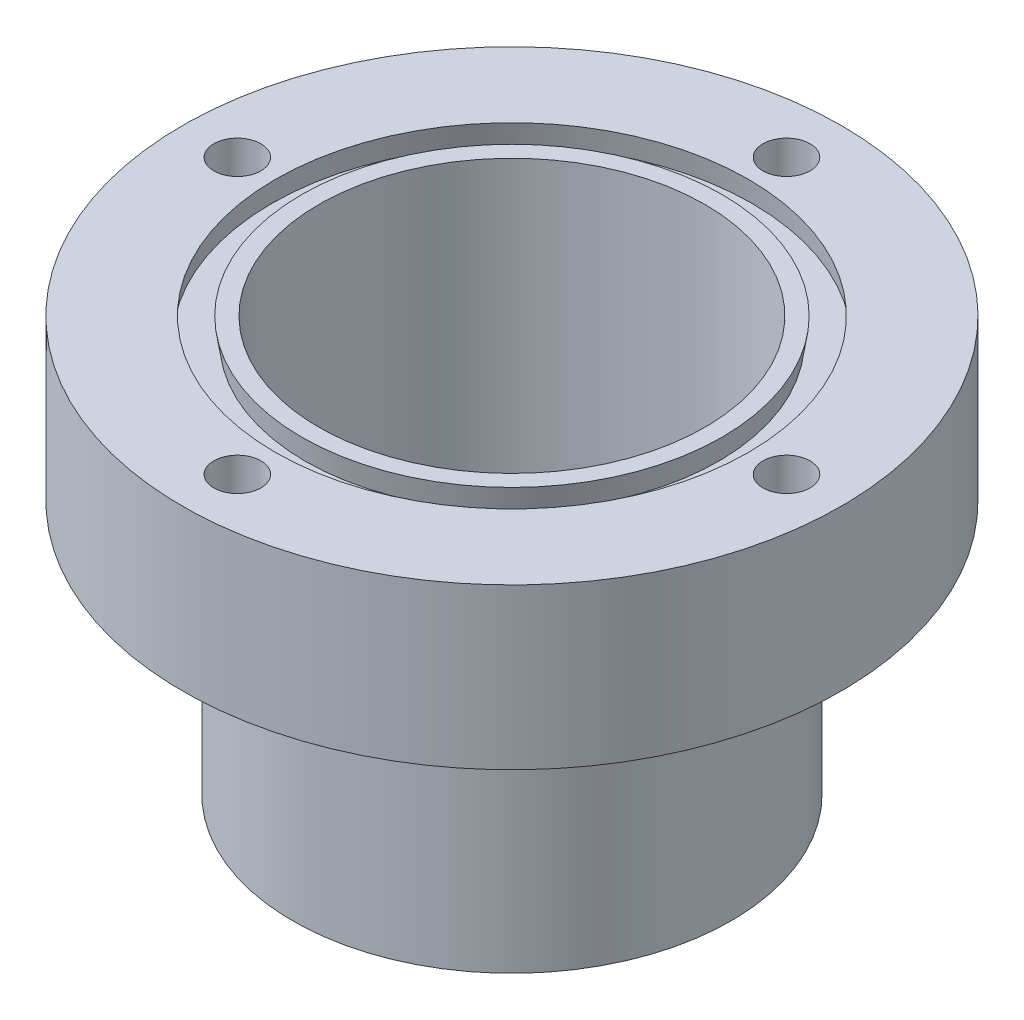
ISO-10303-21;
HEADER;
FILE_DESCRIPTION(('STEP AP214'),'2;1');
FILE_NAME('part.step','',(''),(''),'','','');
FILE_SCHEMA(('AUTOMOTIVE_DESIGN { 1 0 10303 214 1 1 1 1 }'));
ENDSEC;
DATA;
#1=APPLICATION_CONTEXT('core data for automotive mechanical design processes');
#2=APPLICATION_PROTOCOL_DEFINITION('international standard','automotive_design',2000,#1);
#3=PRODUCT_CONTEXT('',#1,'mechanical');
#4=PRODUCT('Part','Part','',(#3));
#5=PRODUCT_RELATED_PRODUCT_CATEGORY('part','',(#4));
#6=PRODUCT_DEFINITION_FORMATION('','',#4);
#7=PRODUCT_DEFINITION_CONTEXT('part definition',#1,'design');
#8=PRODUCT_DEFINITION('design','',#6,#7);
#9=PRODUCT_DEFINITION_SHAPE('','',#8);
#10=(LENGTH_UNIT() NAMED_UNIT(*) SI_UNIT(.MILLI.,.METRE.));
#11=(NAMED_UNIT(*) PLANE_ANGLE_UNIT() SI_UNIT($,.RADIAN.));
#12=(NAMED_UNIT(*) SI_UNIT($,.STERADIAN.) SOLID_ANGLE_UNIT());
#13=UNCERTAINTY_MEASURE_WITH_UNIT(LENGTH_MEASURE(1.E-05),#10,'distance_accuracy_value','');
#14=(GEOMETRIC_REPRESENTATION_CONTEXT(3) GLOBAL_UNCERTAINTY_ASSIGNED_CONTEXT((#13)) GLOBAL_UNIT_ASSIGNED_CONTEXT((#10,
#11,#12)) REPRESENTATION_CONTEXT('',''));
#15=CARTESIAN_POINT('',(0.,0.,0.));
#16=DIRECTION('',(0.,0.,1.));
#17=DIRECTION('',(1.,0.,0.));
#18=AXIS2_PLACEMENT_3D('',#15,#16,#17);
#19=CARTESIAN_POINT('',(0.,13.5,0.));
#20=DIRECTION('',(0.,-1.,0.));
#21=DIRECTION('',(0.,0.,-1.));
#22=AXIS2_PLACEMENT_3D('',#19,#20,#21);
#23=PLANE('',#22);
#24=CARTESIAN_POINT('',(0.,13.5,-14.58));
#25=DIRECTION('',(0.,1.,0.));
#26=DIRECTION('',(0.,0.,1.));
#27=AXIS2_PLACEMENT_3D('',#24,#25,#26);
#28=CIRCLE('',#27,1.25);
#29=CARTESIAN_POINT('',(0.,13.5,-13.33));
#30=VERTEX_POINT('',#29);
#31=EDGE_CURVE('P0_E73',#30,#30,#28,.T.);
#32=ORIENTED_EDGE('',*,*,#31,.T.);
#33=EDGE_LOOP('',(#32));
#34=FACE_BOUND('',#33,.T.);
#35=CARTESIAN_POINT('',(-14.58,13.5,0.));
#36=DIRECTION('',(0.,1.,0.));
#37=DIRECTION('',(0.,0.,1.));
#38=AXIS2_PLACEMENT_3D('',#35,#36,#37);
#39=CIRCLE('',#38,1.25);
#40=CARTESIAN_POINT('',(-14.58,13.5,1.25));
#41=VERTEX_POINT('',#40);
#42=EDGE_CURVE('P0_E76',#41,#41,#39,.T.);
#43=ORIENTED_EDGE('',*,*,#42,.T.);
#44=EDGE_LOOP('',(#43));
#45=FACE_BOUND('',#44,.T.);
#46=CARTESIAN_POINT('',(0.,13.5,14.58));
#47=DIRECTION('',(0.,1.,0.));
#48=DIRECTION('',(0.,0.,1.));
#49=AXIS2_PLACEMENT_3D('',#46,#47,#48);
#50=CIRCLE('',#49,1.25);
#51=CARTESIAN_POINT('',(0.,13.5,15.83));
#52=VERTEX_POINT('',#51);
#53=EDGE_CURVE('P0_E79',#52,#52,#50,.T.);
#54=ORIENTED_EDGE('',*,*,#53,.T.);
#55=EDGE_LOOP('',(#54));
#56=FACE_BOUND('',#55,.T.);
#57=CARTESIAN_POINT('',(14.58,13.5,0.));
#58=DIRECTION('',(0.,1.,0.));
#59=DIRECTION('',(0.,0.,1.));
#60=AXIS2_PLACEMENT_3D('',#57,#58,#59);
#61=CIRCLE('',#60,1.25);
#62=CARTESIAN_POINT('',(14.58,13.5,1.25));
#63=VERTEX_POINT('',#62);
#64=EDGE_CURVE('P0_E81',#63,#63,#61,.T.);
#65=ORIENTED_EDGE('',*,*,#64,.T.);
#66=EDGE_LOOP('',(#65));
#67=FACE_BOUND('',#66,.T.);
#68=CARTESIAN_POINT('',(0.,13.5,0.));
#69=DIRECTION('',(0.,-1.,0.));
#70=DIRECTION('',(0.,0.,-1.));
#71=AXIS2_PLACEMENT_3D('',#68,#69,#70);
#72=CIRCLE('',#71,11.645);
#73=CARTESIAN_POINT('',(0.,13.5,-11.645));
#74=VERTEX_POINT('',#73);
#75=EDGE_CURVE('P0_E70',#74,#74,#72,.T.);
#76=ORIENTED_EDGE('',*,*,#75,.F.);
#77=EDGE_LOOP('',(#76));
#78=FACE_BOUND('',#77,.T.);
#79=CARTESIAN_POINT('',(0.,13.5,0.));
#80=DIRECTION('',(0.,-1.,0.));
#81=DIRECTION('',(0.,0.,-1.));
#82=AXIS2_PLACEMENT_3D('',#79,#80,#81);
#83=CIRCLE('',#82,17.5);
#84=CARTESIAN_POINT('',(0.,13.5,-17.5));
#85=VERTEX_POINT('',#84);
#86=EDGE_CURVE('P0_E17',#85,#85,#83,.F.);
#87=ORIENTED_EDGE('',*,*,#86,.F.);
#88=EDGE_LOOP('',(#87));
#89=FACE_BOUND('',#88,.T.);
#90=ADVANCED_FACE('P0_F14',(#34,#45,#56,#67,#78,#89),#23,.T.);
#91=CARTESIAN_POINT('',(0.,23.15,0.));
#92=DIRECTION('',(0.,-1.,0.));
#93=DIRECTION('',(0.,0.,-1.));
#94=AXIS2_PLACEMENT_3D('',#91,#92,#93);
#95=CYLINDRICAL_SURFACE('',#94,17.5);
#96=ORIENTED_EDGE('',*,*,#86,.T.);
#97=EDGE_LOOP('',(#96));
#98=FACE_BOUND('',#97,.T.);
#99=CARTESIAN_POINT('',(0.,22.,0.));
#100=DIRECTION('',(0.,-1.,0.));
#101=DIRECTION('',(0.,0.,-1.));
#102=AXIS2_PLACEMENT_3D('',#99,#100,#101);
#103=CIRCLE('',#102,17.5);
#104=CARTESIAN_POINT('',(0.,22.,-17.5));
#105=VERTEX_POINT('',#104);
#106=EDGE_CURVE('P0_E67',#105,#105,#103,.T.);
#107=ORIENTED_EDGE('',*,*,#106,.T.);
#108=EDGE_LOOP('',(#107));
#109=FACE_BOUND('',#108,.T.);
#110=ADVANCED_FACE('P0_F88',(#98,#109),#95,.T.);
#111=CARTESIAN_POINT('',(14.58,10.71137043753,0.));
#112=DIRECTION('',(0.,1.,0.));
#113=DIRECTION('',(0.,0.,1.));
#114=AXIS2_PLACEMENT_3D('',#111,#112,#113);
#115=CYLINDRICAL_SURFACE('',#114,1.25);
#116=ORIENTED_EDGE('',*,*,#64,.F.);
#117=EDGE_LOOP('',(#116));
#118=FACE_BOUND('',#117,.T.);
#119=CARTESIAN_POINT('',(14.58,22.,0.));
#120=DIRECTION('',(0.,1.,0.));
#121=DIRECTION('',(0.,0.,1.));
#122=AXIS2_PLACEMENT_3D('',#119,#120,#121);
#123=CIRCLE('',#122,1.25);
#124=CARTESIAN_POINT('',(14.58,22.,1.25));
#125=VERTEX_POINT('',#124);
#126=EDGE_CURVE('P0_E64',#125,#125,#123,.T.);
#127=ORIENTED_EDGE('',*,*,#126,.T.);
#128=EDGE_LOOP('',(#127));
#129=FACE_BOUND('',#128,.T.);
#130=ADVANCED_FACE('P0_F97',(#118,#129),#115,.F.);
#131=CARTESIAN_POINT('',(0.,10.71137043753,14.58));
#132=DIRECTION('',(0.,1.,0.));
#133=DIRECTION('',(0.,0.,1.));
#134=AXIS2_PLACEMENT_3D('',#131,#132,#133);
#135=CYLINDRICAL_SURFACE('',#134,1.25);
#136=ORIENTED_EDGE('',*,*,#53,.F.);
#137=EDGE_LOOP('',(#136));
#138=FACE_BOUND('',#137,.T.);
#139=CARTESIAN_POINT('',(0.,22.,14.58));
#140=DIRECTION('',(0.,1.,0.));
#141=DIRECTION('',(0.,0.,1.));
#142=AXIS2_PLACEMENT_3D('',#139,#140,#141);
#143=CIRCLE('',#142,1.25);
#144=CARTESIAN_POINT('',(0.,22.,15.83));
#145=VERTEX_POINT('',#144);
#146=EDGE_CURVE('P0_E61',#145,#145,#143,.T.);
#147=ORIENTED_EDGE('',*,*,#146,.T.);
#148=EDGE_LOOP('',(#147));
#149=FACE_BOUND('',#148,.T.);
#150=ADVANCED_FACE('P0_F159',(#138,#149),#135,.F.);
#151=CARTESIAN_POINT('',(-14.58,10.71137043753,0.));
#152=DIRECTION('',(0.,1.,0.));
#153=DIRECTION('',(0.,0.,1.));
#154=AXIS2_PLACEMENT_3D('',#151,#152,#153);
#155=CYLINDRICAL_SURFACE('',#154,1.25);
#156=ORIENTED_EDGE('',*,*,#42,.F.);
#157=EDGE_LOOP('',(#156));
#158=FACE_BOUND('',#157,.T.);
#159=CARTESIAN_POINT('',(-14.58,22.,0.));
#160=DIRECTION('',(0.,1.,0.));
#161=DIRECTION('',(0.,0.,1.));
#162=AXIS2_PLACEMENT_3D('',#159,#160,#161);
#163=CIRCLE('',#162,1.25);
#164=CARTESIAN_POINT('',(-14.58,22.,1.25));
#165=VERTEX_POINT('',#164);
#166=EDGE_CURVE('P0_E58',#165,#165,#163,.T.);
#167=ORIENTED_EDGE('',*,*,#166,.T.);
#168=EDGE_LOOP('',(#167));
#169=FACE_BOUND('',#168,.T.);
#170=ADVANCED_FACE('P0_F155',(#158,#169),#155,.F.);
#171=CARTESIAN_POINT('',(0.,10.71137043753,-14.58));
#172=DIRECTION('',(0.,1.,0.));
#173=DIRECTION('',(0.,0.,1.));
#174=AXIS2_PLACEMENT_3D('',#171,#172,#173);
#175=CYLINDRICAL_SURFACE('',#174,1.25);
#176=ORIENTED_EDGE('',*,*,#31,.F.);
#177=EDGE_LOOP('',(#176));
#178=FACE_BOUND('',#177,.T.);
#179=CARTESIAN_POINT('',(0.,22.,-14.58));
#180=DIRECTION('',(0.,1.,0.));
#181=DIRECTION('',(0.,0.,1.));
#182=AXIS2_PLACEMENT_3D('',#179,#180,#181);
#183=CIRCLE('',#182,1.25);
#184=CARTESIAN_POINT('',(0.,22.,-13.33));
#185=VERTEX_POINT('',#184);
#186=EDGE_CURVE('P0_E55',#185,#185,#183,.T.);
#187=ORIENTED_EDGE('',*,*,#186,.T.);
#188=EDGE_LOOP('',(#187));
#189=FACE_BOUND('',#188,.T.);
#190=ADVANCED_FACE('P0_F151',(#178,#189),#175,.F.);
#191=CARTESIAN_POINT('',(0.,23.15,0.));
#192=DIRECTION('',(0.,-1.,0.));
#193=DIRECTION('',(0.,0.,-1.));
#194=AXIS2_PLACEMENT_3D('',#191,#192,#193);
#195=CYLINDRICAL_SURFACE('',#194,11.645);
#196=CARTESIAN_POINT('',(0.,0.,0.));
#197=DIRECTION('',(0.,-1.,0.));
#198=DIRECTION('',(0.,0.,-1.));
#199=AXIS2_PLACEMENT_3D('',#196,#197,#198);
#200=CIRCLE('',#199,11.645);
#201=CARTESIAN_POINT('',(0.,0.,-11.645));
#202=VERTEX_POINT('',#201);
#203=EDGE_CURVE('P0_E52',#202,#202,#200,.T.);
#204=ORIENTED_EDGE('',*,*,#203,.F.);
#205=EDGE_LOOP('',(#204));
#206=FACE_BOUND('',#205,.T.);
#207=ORIENTED_EDGE('',*,*,#75,.T.);
#208=EDGE_LOOP('',(#207));
#209=FACE_BOUND('',#208,.T.);
#210=ADVANCED_FACE('P0_F147',(#206,#209),#195,.T.);
#211=CARTESIAN_POINT('',(0.,22.,0.));
#212=DIRECTION('',(0.,-1.,0.));
#213=DIRECTION('',(0.,0.,-1.));
#214=AXIS2_PLACEMENT_3D('',#211,#212,#213);
#215=PLANE('',#214);
#216=CARTESIAN_POINT('',(0.,22.,0.));
#217=DIRECTION('',(0.,-1.,0.));
#218=DIRECTION('',(0.,0.,-1.));
#219=AXIS2_PLACEMENT_3D('',#216,#217,#218);
#220=CIRCLE('',#219,12.56);
#221=CARTESIAN_POINT('',(0.,22.,-12.56));
#222=VERTEX_POINT('',#221);
#223=EDGE_CURVE('P0_E49',#222,#222,#220,.T.);
#224=ORIENTED_EDGE('',*,*,#223,.T.);
#225=EDGE_LOOP('',(#224));
#226=FACE_BOUND('',#225,.T.);
#227=ORIENTED_EDGE('',*,*,#186,.F.);
#228=EDGE_LOOP('',(#227));
#229=FACE_BOUND('',#228,.T.);
#230=ORIENTED_EDGE('',*,*,#166,.F.);
#231=EDGE_LOOP('',(#230));
#232=FACE_BOUND('',#231,.T.);
#233=ORIENTED_EDGE('',*,*,#146,.F.);
#234=EDGE_LOOP('',(#233));
#235=FACE_BOUND('',#234,.T.);
#236=ORIENTED_EDGE('',*,*,#126,.F.);
#237=EDGE_LOOP('',(#236));
#238=FACE_BOUND('',#237,.T.);
#239=ORIENTED_EDGE('',*,*,#106,.F.);
#240=EDGE_LOOP('',(#239));
#241=FACE_BOUND('',#240,.T.);
#242=ADVANCED_FACE('P0_F143',(#226,#229,#232,#235,#238,#241),#215,.F.);
#243=CARTESIAN_POINT('',(0.,0.,0.));
#244=DIRECTION('',(0.,-1.,0.));
#245=DIRECTION('',(0.,0.,-1.));
#246=AXIS2_PLACEMENT_3D('',#243,#244,#245);
#247=PLANE('',#246);
#248=CARTESIAN_POINT('',(0.,0.,0.));
#249=DIRECTION('',(0.,-1.,0.));
#250=DIRECTION('',(0.,0.,-1.));
#251=AXIS2_PLACEMENT_3D('',#248,#249,#250);
#252=CIRCLE('',#251,5.25);
#253=CARTESIAN_POINT('',(0.,0.,-5.25));
#254=VERTEX_POINT('',#253);
#255=EDGE_CURVE('P0_E46',#254,#254,#252,.T.);
#256=ORIENTED_EDGE('',*,*,#255,.F.);
#257=EDGE_LOOP('',(#256));
#258=FACE_BOUND('',#257,.T.);
#259=ORIENTED_EDGE('',*,*,#203,.T.);
#260=EDGE_LOOP('',(#259));
#261=FACE_BOUND('',#260,.T.);
#262=ADVANCED_FACE('P0_F139',(#258,#261),#247,.T.);
#263=CARTESIAN_POINT('',(0.,20.8,0.));
#264=DIRECTION('',(0.,-1.,0.));
#265=DIRECTION('',(0.,0.,-1.));
#266=AXIS2_PLACEMENT_3D('',#263,#264,#265);
#267=CONICAL_SURFACE('',#266,12.745,0.152962415423203);
#268=CARTESIAN_POINT('',(0.,20.8,0.));
#269=DIRECTION('',(0.,-1.,0.));
#270=DIRECTION('',(0.,0.,-1.));
#271=AXIS2_PLACEMENT_3D('',#268,#269,#270);
#272=CIRCLE('',#271,12.745);
#273=CARTESIAN_POINT('',(0.,20.8,-12.745));
#274=VERTEX_POINT('',#273);
#275=EDGE_CURVE('P0_E43',#274,#274,#272,.F.);
#276=ORIENTED_EDGE('',*,*,#275,.F.);
#277=EDGE_LOOP('',(#276));
#278=FACE_BOUND('',#277,.T.);
#279=ORIENTED_EDGE('',*,*,#223,.F.);
#280=EDGE_LOOP('',(#279));
#281=FACE_BOUND('',#280,.T.);
#282=ADVANCED_FACE('P0_F135',(#278,#281),#267,.F.);
#283=CARTESIAN_POINT('',(0.,23.15,0.));
#284=DIRECTION('',(0.,-1.,0.));
#285=DIRECTION('',(0.,0.,-1.));
#286=AXIS2_PLACEMENT_3D('',#283,#284,#285);
#287=CYLINDRICAL_SURFACE('',#286,5.25);
#288=CARTESIAN_POINT('',(0.,-1.,0.));
#289=DIRECTION('',(0.,-1.,0.));
#290=DIRECTION('',(0.,0.,-1.));
#291=AXIS2_PLACEMENT_3D('',#288,#289,#290);
#292=CIRCLE('',#291,5.25);
#293=CARTESIAN_POINT('',(0.,-1.,-5.25));
#294=VERTEX_POINT('',#293);
#295=EDGE_CURVE('P0_E40',#294,#294,#292,.T.);
#296=ORIENTED_EDGE('',*,*,#295,.F.);
#297=EDGE_LOOP('',(#296));
#298=FACE_BOUND('',#297,.T.);
#299=ORIENTED_EDGE('',*,*,#255,.T.);
#300=EDGE_LOOP('',(#299));
#301=FACE_BOUND('',#300,.T.);
#302=ADVANCED_FACE('P0_F131',(#298,#301),#287,.T.);
#303=CARTESIAN_POINT('',(0.,20.8,0.));
#304=DIRECTION('',(0.,1.,0.));
#305=DIRECTION('',(0.,0.,1.));
#306=AXIS2_PLACEMENT_3D('',#303,#304,#305);
#307=PLANE('',#306);
#308=CARTESIAN_POINT('',(0.,20.8,0.));
#309=DIRECTION('',(0.,1.,0.));
#310=DIRECTION('',(0.,0.,1.));
#311=AXIS2_PLACEMENT_3D('',#308,#309,#310);
#312=CIRCLE('',#311,10.975);
#313=CARTESIAN_POINT('',(0.,20.8,10.975));
#314=VERTEX_POINT('',#313);
#315=EDGE_CURVE('P0_E37',#314,#314,#312,.T.);
#316=ORIENTED_EDGE('',*,*,#315,.F.);
#317=EDGE_LOOP('',(#316));
#318=FACE_BOUND('',#317,.T.);
#319=ORIENTED_EDGE('',*,*,#275,.T.);
#320=EDGE_LOOP('',(#319));
#321=FACE_BOUND('',#320,.T.);
#322=ADVANCED_FACE('P0_F127',(#318,#321),#307,.T.);
#323=CARTESIAN_POINT('',(0.,-1.,0.));
#324=DIRECTION('',(0.,-1.,0.));
#325=DIRECTION('',(0.,0.,-1.));
#326=AXIS2_PLACEMENT_3D('',#323,#324,#325);
#327=PLANE('',#326);
#328=CARTESIAN_POINT('',(0.,-1.,0.));
#329=DIRECTION('',(0.,-1.,0.));
#330=DIRECTION('',(0.,0.,-1.));
#331=AXIS2_PLACEMENT_3D('',#328,#329,#330);
#332=CIRCLE('',#331,4.7625);
#333=CARTESIAN_POINT('',(0.,-1.,-4.7625));
#334=VERTEX_POINT('',#333);
#335=EDGE_CURVE('P0_E34',#334,#334,#332,.F.);
#336=ORIENTED_EDGE('',*,*,#335,.T.);
#337=EDGE_LOOP('',(#336));
#338=FACE_BOUND('',#337,.T.);
#339=ORIENTED_EDGE('',*,*,#295,.T.);
#340=EDGE_LOOP('',(#339));
#341=FACE_BOUND('',#340,.T.);
#342=ADVANCED_FACE('P0_F123',(#338,#341),#327,.T.);
#343=CARTESIAN_POINT('',(0.,22.,0.));
#344=DIRECTION('',(0.,1.,0.));
#345=DIRECTION('',(0.,0.,1.));
#346=AXIS2_PLACEMENT_3D('',#343,#344,#345);
#347=CONICAL_SURFACE('',#346,11.16,0.152962415423203);
#348=ORIENTED_EDGE('',*,*,#315,.T.);
#349=EDGE_LOOP('',(#348));
#350=FACE_BOUND('',#349,.T.);
#351=CARTESIAN_POINT('',(0.,22.,0.));
#352=DIRECTION('',(0.,1.,0.));
#353=DIRECTION('',(0.,0.,1.));
#354=AXIS2_PLACEMENT_3D('',#351,#352,#353);
#355=CIRCLE('',#354,11.16);
#356=CARTESIAN_POINT('',(0.,22.,11.16));
#357=VERTEX_POINT('',#356);
#358=EDGE_CURVE('P0_E31',#357,#357,#355,.F.);
#359=ORIENTED_EDGE('',*,*,#358,.T.);
#360=EDGE_LOOP('',(#359));
#361=FACE_BOUND('',#360,.T.);
#362=ADVANCED_FACE('P0_F119',(#350,#361),#347,.T.);
#363=CARTESIAN_POINT('',(0.,23.15,0.));
#364=DIRECTION('',(0.,-1.,0.));
#365=DIRECTION('',(0.,0.,-1.));
#366=AXIS2_PLACEMENT_3D('',#363,#364,#365);
#367=CYLINDRICAL_SURFACE('',#366,4.7625);
#368=ORIENTED_EDGE('',*,*,#335,.F.);
#369=EDGE_LOOP('',(#368));
#370=FACE_BOUND('',#369,.T.);
#371=CARTESIAN_POINT('',(0.,3.,0.));
#372=DIRECTION('',(0.,-1.,0.));
#373=DIRECTION('',(0.,0.,-1.));
#374=AXIS2_PLACEMENT_3D('',#371,#372,#373);
#375=CIRCLE('',#374,4.7625);
#376=CARTESIAN_POINT('',(0.,3.,-4.7625));
#377=VERTEX_POINT('',#376);
#378=EDGE_CURVE('P0_E26',#377,#377,#375,.F.);
#379=ORIENTED_EDGE('',*,*,#378,.T.);
#380=EDGE_LOOP('',(#379));
#381=FACE_BOUND('',#380,.T.);
#382=ADVANCED_FACE('P0_F115',(#370,#381),#367,.F.);
#383=CARTESIAN_POINT('',(0.,22.,0.));
#384=DIRECTION('',(0.,-1.,0.));
#385=DIRECTION('',(0.,0.,-1.));
#386=AXIS2_PLACEMENT_3D('',#383,#384,#385);
#387=PLANE('',#386);
#388=CARTESIAN_POINT('',(0.,22.,0.));
#389=DIRECTION('',(0.,-1.,0.));
#390=DIRECTION('',(0.,0.,-1.));
#391=AXIS2_PLACEMENT_3D('',#388,#389,#390);
#392=CIRCLE('',#391,10.25);
#393=CARTESIAN_POINT('',(0.,22.,-10.25));
#394=VERTEX_POINT('',#393);
#395=EDGE_CURVE('P0_E21',#394,#394,#392,.T.);
#396=ORIENTED_EDGE('',*,*,#395,.T.);
#397=EDGE_LOOP('',(#396));
#398=FACE_BOUND('',#397,.T.);
#399=ORIENTED_EDGE('',*,*,#358,.F.);
#400=EDGE_LOOP('',(#399));
#401=FACE_BOUND('',#400,.T.);
#402=ADVANCED_FACE('P0_F107',(#398,#401),#387,.F.);
#403=CARTESIAN_POINT('',(0.,3.,0.));
#404=DIRECTION('',(0.,-1.,0.));
#405=DIRECTION('',(0.,0.,-1.));
#406=AXIS2_PLACEMENT_3D('',#403,#404,#405);
#407=PLANE('',#406);
#408=ORIENTED_EDGE('',*,*,#378,.F.);
#409=EDGE_LOOP('',(#408));
#410=FACE_BOUND('',#409,.T.);
#411=CARTESIAN_POINT('',(0.,3.,0.));
#412=DIRECTION('',(0.,-1.,0.));
#413=DIRECTION('',(0.,0.,-1.));
#414=AXIS2_PLACEMENT_3D('',#411,#412,#413);
#415=CIRCLE('',#414,10.25);
#416=CARTESIAN_POINT('',(0.,3.,-10.25));
#417=VERTEX_POINT('',#416);
#418=EDGE_CURVE('P0_E10',#417,#417,#415,.F.);
#419=ORIENTED_EDGE('',*,*,#418,.T.);
#420=EDGE_LOOP('',(#419));
#421=FACE_BOUND('',#420,.T.);
#422=ADVANCED_FACE('P0_F101',(#410,#421),#407,.F.);
#423=CARTESIAN_POINT('',(0.,23.15,0.));
#424=DIRECTION('',(0.,-1.,0.));
#425=DIRECTION('',(0.,0.,-1.));
#426=AXIS2_PLACEMENT_3D('',#423,#424,#425);
#427=CYLINDRICAL_SURFACE('',#426,10.25);
#428=ORIENTED_EDGE('',*,*,#395,.F.);
#429=EDGE_LOOP('',(#428));
#430=FACE_BOUND('',#429,.T.);
#431=ORIENTED_EDGE('',*,*,#418,.F.);
#432=EDGE_LOOP('',(#431));
#433=FACE_BOUND('',#432,.T.);
#434=ADVANCED_FACE('P0_F99',(#430,#433),#427,.F.);
#435=CLOSED_SHELL('',(#90,#110,#130,#150,#170,#190,#210,#242,#262,#282,#302,#322,#342,#362,#382,
#402,#422,#434));
#436=MANIFOLD_SOLID_BREP('P0_B1',#435);
#437=CARTESIAN_POINT('',(14.58,10.71137043753,0.));
#438=DIRECTION('',(0.,1.,0.));
#439=DIRECTION('',(0.,0.,1.));
#440=AXIS2_PLACEMENT_3D('',#437,#438,#439);
#441=CYLINDRICAL_SURFACE('',#440,1.5);
#442=CARTESIAN_POINT('',(14.58,13.5,0.));
#443=DIRECTION('',(0.,1.,0.));
#444=DIRECTION('',(0.,0.,1.));
#445=AXIS2_PLACEMENT_3D('',#442,#443,#444);
#446=CIRCLE('',#445,1.5);
#447=CARTESIAN_POINT('',(14.58,13.5,1.5));
#448=VERTEX_POINT('',#447);
#449=EDGE_CURVE('P1_E10',#448,#448,#446,.T.);
#450=ORIENTED_EDGE('',*,*,#449,.T.);
#451=EDGE_LOOP('',(#450));
#452=FACE_BOUND('',#451,.T.);
#453=CARTESIAN_POINT('',(14.58,22.,0.));
#454=DIRECTION('',(0.,1.,0.));
#455=DIRECTION('',(0.,0.,1.));
#456=AXIS2_PLACEMENT_3D('',#453,#454,#455);
#457=CIRCLE('',#456,1.5);
#458=CARTESIAN_POINT('',(14.58,22.,1.5));
#459=VERTEX_POINT('',#458);
#460=EDGE_CURVE('P1_E15',#459,#459,#457,.F.);
#461=ORIENTED_EDGE('',*,*,#460,.T.);
#462=EDGE_LOOP('',(#461));
#463=FACE_BOUND('',#462,.T.);
#464=ADVANCED_FACE('P1_F14',(#452,#463),#441,.T.);
#465=OPEN_SHELL('',(#464));
#466=SHELL_BASED_SURFACE_MODEL('P1_B1',(#465));
#467=CARTESIAN_POINT('',(0.,10.71137043753,14.58));
#468=DIRECTION('',(0.,1.,0.));
#469=DIRECTION('',(0.,0.,1.));
#470=AXIS2_PLACEMENT_3D('',#467,#468,#469);
#471=CYLINDRICAL_SURFACE('',#470,1.5);
#472=CARTESIAN_POINT('',(0.,13.5,14.58));
#473=DIRECTION('',(0.,1.,0.));
#474=DIRECTION('',(0.,0.,1.));
#475=AXIS2_PLACEMENT_3D('',#472,#473,#474);
#476=CIRCLE('',#475,1.5);
#477=CARTESIAN_POINT('',(0.,13.5,16.08));
#478=VERTEX_POINT('',#477);
#479=EDGE_CURVE('P2_E10',#478,#478,#476,.T.);
#480=ORIENTED_EDGE('',*,*,#479,.T.);
#481=EDGE_LOOP('',(#480));
#482=FACE_BOUND('',#481,.T.);
#483=CARTESIAN_POINT('',(0.,22.,14.58));
#484=DIRECTION('',(0.,1.,0.));
#485=DIRECTION('',(0.,0.,1.));
#486=AXIS2_PLACEMENT_3D('',#483,#484,#485);
#487=CIRCLE('',#486,1.5);
#488=CARTESIAN_POINT('',(0.,22.,16.08));
#489=VERTEX_POINT('',#488);
#490=EDGE_CURVE('P2_E15',#489,#489,#487,.F.);
#491=ORIENTED_EDGE('',*,*,#490,.T.);
#492=EDGE_LOOP('',(#491));
#493=FACE_BOUND('',#492,.T.);
#494=ADVANCED_FACE('P2_F14',(#482,#493),#471,.T.);
#495=OPEN_SHELL('',(#494));
#496=SHELL_BASED_SURFACE_MODEL('P2_B1',(#495));
#497=CARTESIAN_POINT('',(-14.58,10.71137043753,0.));
#498=DIRECTION('',(0.,1.,0.));
#499=DIRECTION('',(0.,0.,1.));
#500=AXIS2_PLACEMENT_3D('',#497,#498,#499);
#501=CYLINDRICAL_SURFACE('',#500,1.5);
#502=CARTESIAN_POINT('',(-14.58,13.5,0.));
#503=DIRECTION('',(0.,1.,0.));
#504=DIRECTION('',(0.,0.,1.));
#505=AXIS2_PLACEMENT_3D('',#502,#503,#504);
#506=CIRCLE('',#505,1.5);
#507=CARTESIAN_POINT('',(-14.58,13.5,1.5));
#508=VERTEX_POINT('',#507);
#509=EDGE_CURVE('P3_E10',#508,#508,#506,.T.);
#510=ORIENTED_EDGE('',*,*,#509,.T.);
#511=EDGE_LOOP('',(#510));
#512=FACE_BOUND('',#511,.T.);
#513=CARTESIAN_POINT('',(-14.58,22.,0.));
#514=DIRECTION('',(0.,1.,0.));
#515=DIRECTION('',(0.,0.,1.));
#516=AXIS2_PLACEMENT_3D('',#513,#514,#515);
#517=CIRCLE('',#516,1.5);
#518=CARTESIAN_POINT('',(-14.58,22.,1.5));
#519=VERTEX_POINT('',#518);
#520=EDGE_CURVE('P3_E15',#519,#519,#517,.F.);
#521=ORIENTED_EDGE('',*,*,#520,.T.);
#522=EDGE_LOOP('',(#521));
#523=FACE_BOUND('',#522,.T.);
#524=ADVANCED_FACE('P3_F14',(#512,#523),#501,.T.);
#525=OPEN_SHELL('',(#524));
#526=SHELL_BASED_SURFACE_MODEL('P3_B1',(#525));
#527=CARTESIAN_POINT('',(0.,10.71137043753,-14.58));
#528=DIRECTION('',(0.,1.,0.));
#529=DIRECTION('',(0.,0.,1.));
#530=AXIS2_PLACEMENT_3D('',#527,#528,#529);
#531=CYLINDRICAL_SURFACE('',#530,1.5);
#532=CARTESIAN_POINT('',(0.,13.5,-14.58));
#533=DIRECTION('',(0.,1.,0.));
#534=DIRECTION('',(0.,0.,1.));
#535=AXIS2_PLACEMENT_3D('',#532,#533,#534);
#536=CIRCLE('',#535,1.5);
#537=CARTESIAN_POINT('',(0.,13.5,-13.08));
#538=VERTEX_POINT('',#537);
#539=EDGE_CURVE('P4_E10',#538,#538,#536,.T.);
#540=ORIENTED_EDGE('',*,*,#539,.T.);
#541=EDGE_LOOP('',(#540));
#542=FACE_BOUND('',#541,.T.);
#543=CARTESIAN_POINT('',(0.,22.,-14.58));
#544=DIRECTION('',(0.,1.,0.));
#545=DIRECTION('',(0.,0.,1.));
#546=AXIS2_PLACEMENT_3D('',#543,#544,#545);
#547=CIRCLE('',#546,1.5);
#548=CARTESIAN_POINT('',(0.,22.,-13.08));
#549=VERTEX_POINT('',#548);
#550=EDGE_CURVE('P4_E15',#549,#549,#547,.F.);
#551=ORIENTED_EDGE('',*,*,#550,.T.);
#552=EDGE_LOOP('',(#551));
#553=FACE_BOUND('',#552,.T.);
#554=ADVANCED_FACE('P4_F14',(#542,#553),#531,.T.);
#555=OPEN_SHELL('',(#554));
#556=SHELL_BASED_SURFACE_MODEL('P4_B1',(#555));
#557=ADVANCED_BREP_SHAPE_REPRESENTATION('',(#18,#436),#14);
#558=MANIFOLD_SURFACE_SHAPE_REPRESENTATION('',(#18,#466,#496,#526,#556),#14);
#559=SHAPE_REPRESENTATION('',(#18),#14);
#560=SHAPE_DEFINITION_REPRESENTATION(#9,#559);
#561=SHAPE_REPRESENTATION_RELATIONSHIP('','',#559,#557);
#562=SHAPE_REPRESENTATION_RELATIONSHIP('','',#559,#558);
ENDSEC;
END-ISO-10303-21;
